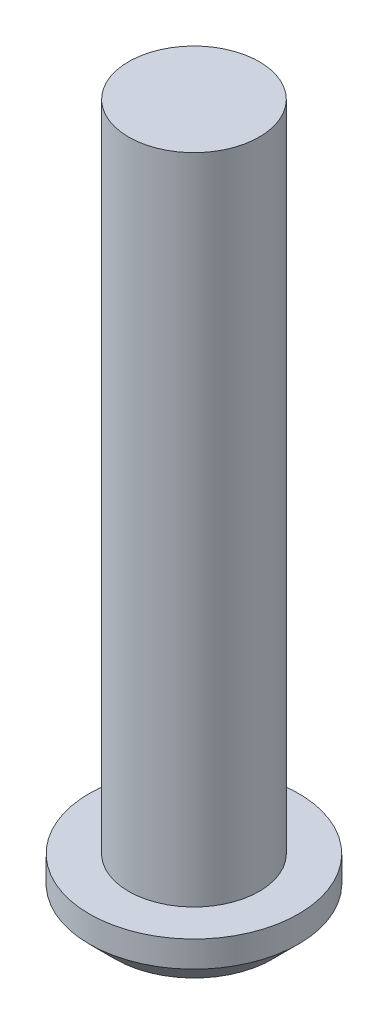
ISO-10303-21;
HEADER;
FILE_DESCRIPTION(('STEP AP214'),'2;1');
FILE_NAME('part.step','',(''),(''),'','','');
FILE_SCHEMA(('AUTOMOTIVE_DESIGN { 1 0 10303 214 1 1 1 1 }'));
ENDSEC;
DATA;
#1=APPLICATION_CONTEXT('core data for automotive mechanical design processes');
#2=APPLICATION_PROTOCOL_DEFINITION('international standard','automotive_design',2000,#1);
#3=PRODUCT_CONTEXT('',#1,'mechanical');
#4=PRODUCT('Part','Part','',(#3));
#5=PRODUCT_RELATED_PRODUCT_CATEGORY('part','',(#4));
#6=PRODUCT_DEFINITION_FORMATION('','',#4);
#7=PRODUCT_DEFINITION_CONTEXT('part definition',#1,'design');
#8=PRODUCT_DEFINITION('design','',#6,#7);
#9=PRODUCT_DEFINITION_SHAPE('','',#8);
#10=(LENGTH_UNIT() NAMED_UNIT(*) SI_UNIT(.MILLI.,.METRE.));
#11=(NAMED_UNIT(*) PLANE_ANGLE_UNIT() SI_UNIT($,.RADIAN.));
#12=(NAMED_UNIT(*) SI_UNIT($,.STERADIAN.) SOLID_ANGLE_UNIT());
#13=UNCERTAINTY_MEASURE_WITH_UNIT(LENGTH_MEASURE(1.E-05),#10,'distance_accuracy_value','');
#14=(GEOMETRIC_REPRESENTATION_CONTEXT(3) GLOBAL_UNCERTAINTY_ASSIGNED_CONTEXT((#13)) GLOBAL_UNIT_ASSIGNED_CONTEXT((#10,
#11,#12)) REPRESENTATION_CONTEXT('',''));
#15=CARTESIAN_POINT('',(0.,0.,0.));
#16=DIRECTION('',(0.,0.,1.));
#17=DIRECTION('',(1.,0.,0.));
#18=AXIS2_PLACEMENT_3D('',#15,#16,#17);
#19=CARTESIAN_POINT('',(0.,2.,0.));
#20=DIRECTION('',(0.,-1.,0.));
#21=DIRECTION('',(0.,0.,-1.));
#22=AXIS2_PLACEMENT_3D('',#19,#20,#21);
#23=CYLINDRICAL_SURFACE('',#22,4.);
#24=CARTESIAN_POINT('',(0.,1.,0.));
#25=DIRECTION('',(0.,1.,0.));
#26=DIRECTION('',(0.,0.,1.));
#27=AXIS2_PLACEMENT_3D('',#24,#25,#26);
#28=CIRCLE('',#27,4.);
#29=CARTESIAN_POINT('',(0.,1.,4.));
#30=VERTEX_POINT('',#29);
#31=EDGE_CURVE('E50',#30,#30,#28,.T.);
#32=ORIENTED_EDGE('',*,*,#31,.T.);
#33=EDGE_LOOP('',(#32));
#34=FACE_BOUND('',#33,.T.);
#35=CARTESIAN_POINT('',(0.,2.,0.));
#36=DIRECTION('',(0.,1.,0.));
#37=DIRECTION('',(0.,0.,1.));
#38=AXIS2_PLACEMENT_3D('',#35,#36,#37);
#39=CIRCLE('',#38,4.);
#40=CARTESIAN_POINT('',(0.,2.,4.));
#41=VERTEX_POINT('',#40);
#42=EDGE_CURVE('E67',#41,#41,#39,.T.);
#43=ORIENTED_EDGE('',*,*,#42,.F.);
#44=EDGE_LOOP('',(#43));
#45=FACE_BOUND('',#44,.T.);
#46=ADVANCED_FACE('F42',(#34,#45),#23,.T.);
#47=CARTESIAN_POINT('',(0.,2.,0.));
#48=DIRECTION('',(0.,1.,0.));
#49=DIRECTION('',(0.,0.,1.));
#50=AXIS2_PLACEMENT_3D('',#47,#48,#49);
#51=PLANE('',#50);
#52=CARTESIAN_POINT('',(0.,2.,0.));
#53=DIRECTION('',(0.,1.,0.));
#54=DIRECTION('',(0.,0.,1.));
#55=AXIS2_PLACEMENT_3D('',#52,#53,#54);
#56=CIRCLE('',#55,2.5);
#57=CARTESIAN_POINT('',(0.,2.,2.5));
#58=VERTEX_POINT('',#57);
#59=EDGE_CURVE('E74',#58,#58,#56,.T.);
#60=ORIENTED_EDGE('',*,*,#59,.F.);
#61=EDGE_LOOP('',(#60));
#62=FACE_BOUND('',#61,.T.);
#63=ORIENTED_EDGE('',*,*,#42,.T.);
#64=EDGE_LOOP('',(#63));
#65=FACE_BOUND('',#64,.T.);
#66=ADVANCED_FACE('F93',(#62,#65),#51,.T.);
#67=CARTESIAN_POINT('',(0.,0.,0.));
#68=DIRECTION('',(0.,1.,0.));
#69=DIRECTION('',(0.,0.,1.));
#70=AXIS2_PLACEMENT_3D('',#67,#68,#69);
#71=PLANE('',#70);
#72=CARTESIAN_POINT('',(0.,0.,0.));
#73=DIRECTION('',(0.,1.,0.));
#74=DIRECTION('',(0.,0.,1.));
#75=AXIS2_PLACEMENT_3D('',#72,#73,#74);
#76=CIRCLE('',#75,3.);
#77=CARTESIAN_POINT('',(0.,0.,3.));
#78=VERTEX_POINT('',#77);
#79=EDGE_CURVE('E11',#78,#78,#76,.F.);
#80=ORIENTED_EDGE('',*,*,#79,.T.);
#81=EDGE_LOOP('',(#80));
#82=FACE_BOUND('',#81,.T.);
#83=CARTESIAN_POINT('',(0.,0.,0.));
#84=DIRECTION('',(0.,-1.,0.));
#85=DIRECTION('',(0.,0.,-1.));
#86=AXIS2_PLACEMENT_3D('',#83,#84,#85);
#87=CIRCLE('',#86,1.025);
#88=CARTESIAN_POINT('',(0.,0.,-1.025));
#89=VERTEX_POINT('',#88);
#90=EDGE_CURVE('E70',#89,#89,#87,.T.);
#91=ORIENTED_EDGE('',*,*,#90,.F.);
#92=EDGE_LOOP('',(#91));
#93=FACE_BOUND('',#92,.T.);
#94=ADVANCED_FACE('F97',(#82,#93),#71,.F.);
#95=CARTESIAN_POINT('',(0.,27.,0.));
#96=DIRECTION('',(0.,-1.,0.));
#97=DIRECTION('',(0.,0.,-1.));
#98=AXIS2_PLACEMENT_3D('',#95,#96,#97);
#99=CYLINDRICAL_SURFACE('',#98,2.5);
#100=CARTESIAN_POINT('',(0.,27.,0.));
#101=DIRECTION('',(0.,1.,0.));
#102=DIRECTION('',(0.,0.,1.));
#103=AXIS2_PLACEMENT_3D('',#100,#101,#102);
#104=CIRCLE('',#103,2.5);
#105=CARTESIAN_POINT('',(0.,27.,2.5));
#106=VERTEX_POINT('',#105);
#107=EDGE_CURVE('E63',#106,#106,#104,.T.);
#108=ORIENTED_EDGE('',*,*,#107,.F.);
#109=EDGE_LOOP('',(#108));
#110=FACE_BOUND('',#109,.T.);
#111=ORIENTED_EDGE('',*,*,#59,.T.);
#112=EDGE_LOOP('',(#111));
#113=FACE_BOUND('',#112,.T.);
#114=ADVANCED_FACE('F102',(#110,#113),#99,.T.);
#115=CARTESIAN_POINT('',(0.,27.,0.));
#116=DIRECTION('',(0.,1.,0.));
#117=DIRECTION('',(0.,0.,1.));
#118=AXIS2_PLACEMENT_3D('',#115,#116,#117);
#119=PLANE('',#118);
#120=ORIENTED_EDGE('',*,*,#107,.T.);
#121=EDGE_LOOP('',(#120));
#122=FACE_BOUND('',#121,.T.);
#123=ADVANCED_FACE('F57',(#122),#119,.T.);
#124=CARTESIAN_POINT('',(0.,8.,0.));
#125=DIRECTION('',(0.,-1.,0.));
#126=DIRECTION('',(0.,0.,-1.));
#127=AXIS2_PLACEMENT_3D('',#124,#125,#126);
#128=CONICAL_SURFACE('',#127,0.799999999999998,1.02974425867665);
#129=CARTESIAN_POINT('',(0.,8.48068849522205,0.));
#130=VERTEX_POINT('',#129);
#131=VERTEX_LOOP('',#130);
#132=FACE_BOUND('',#131,.T.);
#133=CARTESIAN_POINT('',(0.,8.,0.));
#134=DIRECTION('',(0.,-1.,0.));
#135=DIRECTION('',(0.,0.,-1.));
#136=AXIS2_PLACEMENT_3D('',#133,#134,#135);
#137=CIRCLE('',#136,0.799999999999998);
#138=CARTESIAN_POINT('',(0.,8.,-0.799999999999998));
#139=VERTEX_POINT('',#138);
#140=EDGE_CURVE('E61',#139,#139,#137,.T.);
#141=ORIENTED_EDGE('',*,*,#140,.T.);
#142=EDGE_LOOP('',(#141));
#143=FACE_BOUND('',#142,.T.);
#144=ADVANCED_FACE('F53',(#132,#143),#128,.F.);
#145=CARTESIAN_POINT('',(0.,0.,0.));
#146=DIRECTION('',(0.,-1.,0.));
#147=DIRECTION('',(0.,0.,-1.));
#148=AXIS2_PLACEMENT_3D('',#145,#146,#147);
#149=CYLINDRICAL_SURFACE('',#148,0.799999999999999);
#150=ORIENTED_EDGE('',*,*,#140,.F.);
#151=EDGE_LOOP('',(#150));
#152=FACE_BOUND('',#151,.T.);
#153=CARTESIAN_POINT('',(0.,0.225,0.));
#154=DIRECTION('',(0.,-1.,0.));
#155=DIRECTION('',(0.,0.,-1.));
#156=AXIS2_PLACEMENT_3D('',#153,#154,#155);
#157=CIRCLE('',#156,0.799999999999999);
#158=CARTESIAN_POINT('',(0.,0.225,-0.799999999999999));
#159=VERTEX_POINT('',#158);
#160=EDGE_CURVE('E64',#159,#159,#157,.T.);
#161=ORIENTED_EDGE('',*,*,#160,.T.);
#162=EDGE_LOOP('',(#161));
#163=FACE_BOUND('',#162,.T.);
#164=ADVANCED_FACE('F56',(#152,#163),#149,.F.);
#165=CARTESIAN_POINT('',(0.,0.,0.));
#166=DIRECTION('',(0.,-1.,0.));
#167=DIRECTION('',(0.,0.,-1.));
#168=AXIS2_PLACEMENT_3D('',#165,#166,#167);
#169=CONICAL_SURFACE('',#168,1.025,0.785398163397445);
#170=ORIENTED_EDGE('',*,*,#160,.F.);
#171=EDGE_LOOP('',(#170));
#172=FACE_BOUND('',#171,.T.);
#173=ORIENTED_EDGE('',*,*,#90,.T.);
#174=EDGE_LOOP('',(#173));
#175=FACE_BOUND('',#174,.T.);
#176=ADVANCED_FACE('F84',(#172,#175),#169,.F.);
#177=CARTESIAN_POINT('',(0.,1.,0.));
#178=DIRECTION('',(0.,1.,0.));
#179=DIRECTION('',(0.,0.,1.));
#180=AXIS2_PLACEMENT_3D('',#177,#178,#179);
#181=CONICAL_SURFACE('',#180,4.,0.78539816339745);
#182=ORIENTED_EDGE('',*,*,#79,.F.);
#183=EDGE_LOOP('',(#182));
#184=FACE_BOUND('',#183,.T.);
#185=ORIENTED_EDGE('',*,*,#31,.F.);
#186=EDGE_LOOP('',(#185));
#187=FACE_BOUND('',#186,.T.);
#188=ADVANCED_FACE('F45',(#184,#187),#181,.T.);
#189=CLOSED_SHELL('',(#46,#66,#94,#114,#123,#144,#164,#176,#188));
#190=MANIFOLD_SOLID_BREP('B2',#189);
#191=ADVANCED_BREP_SHAPE_REPRESENTATION('',(#18,#190),#14);
#192=SHAPE_DEFINITION_REPRESENTATION(#9,#191);
ENDSEC;
END-ISO-10303-21;
